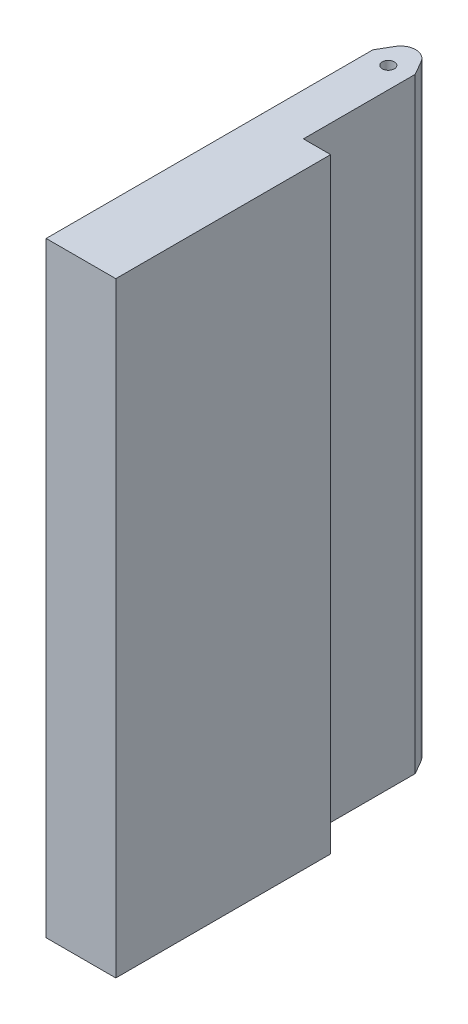
ISO-10303-21;
HEADER;
FILE_DESCRIPTION(('STEP AP214'),'2;1');
FILE_NAME('part.step','',(''),(''),'','','');
FILE_SCHEMA(('AUTOMOTIVE_DESIGN { 1 0 10303 214 1 1 1 1 }'));
ENDSEC;
DATA;
#1=APPLICATION_CONTEXT('core data for automotive mechanical design processes');
#2=APPLICATION_PROTOCOL_DEFINITION('international standard','automotive_design',2000,#1);
#3=PRODUCT_CONTEXT('',#1,'mechanical');
#4=PRODUCT('Part','Part','',(#3));
#5=PRODUCT_RELATED_PRODUCT_CATEGORY('part','',(#4));
#6=PRODUCT_DEFINITION_FORMATION('','',#4);
#7=PRODUCT_DEFINITION_CONTEXT('part definition',#1,'design');
#8=PRODUCT_DEFINITION('design','',#6,#7);
#9=PRODUCT_DEFINITION_SHAPE('','',#8);
#10=(LENGTH_UNIT() NAMED_UNIT(*) SI_UNIT(.MILLI.,.METRE.));
#11=(NAMED_UNIT(*) PLANE_ANGLE_UNIT() SI_UNIT($,.RADIAN.));
#12=(NAMED_UNIT(*) SI_UNIT($,.STERADIAN.) SOLID_ANGLE_UNIT());
#13=UNCERTAINTY_MEASURE_WITH_UNIT(LENGTH_MEASURE(1.E-05),#10,'distance_accuracy_value','');
#14=(GEOMETRIC_REPRESENTATION_CONTEXT(3) GLOBAL_UNCERTAINTY_ASSIGNED_CONTEXT((#13)) GLOBAL_UNIT_ASSIGNED_CONTEXT((#10,
#11,#12)) REPRESENTATION_CONTEXT('',''));
#15=CARTESIAN_POINT('',(0.,0.,0.));
#16=DIRECTION('',(0.,0.,1.));
#17=DIRECTION('',(1.,0.,0.));
#18=AXIS2_PLACEMENT_3D('',#15,#16,#17);
#19=CARTESIAN_POINT('',(0.,0.,-49.9999999999999));
#20=DIRECTION('',(0.,-1.,0.));
#21=DIRECTION('',(0.,0.,-1.));
#22=AXIS2_PLACEMENT_3D('',#19,#20,#21);
#23=CYLINDRICAL_SURFACE('',#22,5.);
#24=DIRECTION('',(0.,-1.,0.));
#25=VECTOR('',#24,1.);
#26=CARTESIAN_POINT('',(-4.33012701892221,0.,-52.4999999999999));
#27=LINE('',#26,#25);
#28=CARTESIAN_POINT('',(-4.33012701892221,200.,-52.4999999999999));
#29=VERTEX_POINT('',#28);
#30=CARTESIAN_POINT('',(-4.33012701892221,0.,-52.4999999999999));
#31=VERTEX_POINT('',#30);
#32=EDGE_CURVE('E157',#29,#31,#27,.T.);
#33=ORIENTED_EDGE('',*,*,#32,.F.);
#34=CARTESIAN_POINT('',(0.,200.,-49.9999999999999));
#35=DIRECTION('',(0.,1.,0.));
#36=DIRECTION('',(0.,0.,1.));
#37=AXIS2_PLACEMENT_3D('',#34,#35,#36);
#38=CIRCLE('',#37,5.);
#39=CARTESIAN_POINT('',(4.3301270189222,200.,-52.4999999999999));
#40=VERTEX_POINT('',#39);
#41=EDGE_CURVE('E41',#40,#29,#38,.T.);
#42=ORIENTED_EDGE('',*,*,#41,.F.);
#43=DIRECTION('',(0.,-1.,0.));
#44=VECTOR('',#43,1.);
#45=CARTESIAN_POINT('',(4.3301270189222,0.,-52.4999999999999));
#46=LINE('',#45,#44);
#47=CARTESIAN_POINT('',(4.3301270189222,0.,-52.4999999999999));
#48=VERTEX_POINT('',#47);
#49=EDGE_CURVE('E161',#48,#40,#46,.F.);
#50=ORIENTED_EDGE('',*,*,#49,.F.);
#51=CARTESIAN_POINT('',(0.,0.,-49.9999999999999));
#52=DIRECTION('',(0.,1.,0.));
#53=DIRECTION('',(0.,0.,1.));
#54=AXIS2_PLACEMENT_3D('',#51,#52,#53);
#55=CIRCLE('',#54,5.);
#56=EDGE_CURVE('E12',#31,#48,#55,.F.);
#57=ORIENTED_EDGE('',*,*,#56,.F.);
#58=EDGE_LOOP('',(#33,#42,#50,#57));
#59=FACE_BOUND('',#58,.T.);
#60=ADVANCED_FACE('F34',(#59),#23,.T.);
#61=CARTESIAN_POINT('',(0.,200.,0.));
#62=DIRECTION('',(0.,1.,0.));
#63=DIRECTION('',(0.,0.,1.));
#64=AXIS2_PLACEMENT_3D('',#61,#62,#63);
#65=PLANE('',#64);
#66=DIRECTION('',(1.,0.,0.));
#67=VECTOR('',#66,1.);
#68=CARTESIAN_POINT('',(7.,200.,-10.9474411167422));
#69=LINE('',#68,#67);
#70=CARTESIAN_POINT('',(7.,200.,-10.9474411167422));
#71=VERTEX_POINT('',#70);
#72=CARTESIAN_POINT('',(16.,200.,-10.9474411167422));
#73=VERTEX_POINT('',#72);
#74=EDGE_CURVE('E48',#71,#73,#69,.T.);
#75=ORIENTED_EDGE('',*,*,#74,.F.);
#76=DIRECTION('',(0.,0.,1.));
#77=VECTOR('',#76,1.);
#78=CARTESIAN_POINT('',(7.,200.,-36.9474411167422));
#79=LINE('',#78,#77);
#80=CARTESIAN_POINT('',(7.,200.,-47.8756443470177));
#81=VERTEX_POINT('',#80);
#82=EDGE_CURVE('E106',#81,#71,#79,.T.);
#83=ORIENTED_EDGE('',*,*,#82,.F.);
#84=DIRECTION('',(-0.499999999999997,0.,-0.866025403784441));
#85=VECTOR('',#84,1.);
#86=CARTESIAN_POINT('',(11.,200.,-40.9474411167422));
#87=LINE('',#86,#85);
#88=EDGE_CURVE('E144',#81,#40,#87,.T.);
#89=ORIENTED_EDGE('',*,*,#88,.T.);
#90=ORIENTED_EDGE('',*,*,#41,.T.);
#91=DIRECTION('',(-0.499999999999996,0.,0.866025403784441));
#92=VECTOR('',#91,1.);
#93=CARTESIAN_POINT('',(0.,200.,-60.));
#94=LINE('',#93,#92);
#95=CARTESIAN_POINT('',(-6.99999999999996,200.,-47.8756443470178));
#96=VERTEX_POINT('',#95);
#97=EDGE_CURVE('E147',#29,#96,#94,.T.);
#98=ORIENTED_EDGE('',*,*,#97,.T.);
#99=DIRECTION('',(0.,0.,-1.));
#100=VECTOR('',#99,1.);
#101=CARTESIAN_POINT('',(-7.00000000000001,200.,-36.9474411167422));
#102=LINE('',#101,#100);
#103=CARTESIAN_POINT('',(-7.00000000000001,200.,60.));
#104=VERTEX_POINT('',#103);
#105=EDGE_CURVE('E136',#104,#96,#102,.T.);
#106=ORIENTED_EDGE('',*,*,#105,.F.);
#107=DIRECTION('',(1.,0.,0.));
#108=VECTOR('',#107,1.);
#109=CARTESIAN_POINT('',(-11.,200.,60.));
#110=LINE('',#109,#108);
#111=CARTESIAN_POINT('',(16.,200.,60.));
#112=VERTEX_POINT('',#111);
#113=EDGE_CURVE('E154',#104,#112,#110,.T.);
#114=ORIENTED_EDGE('',*,*,#113,.T.);
#115=DIRECTION('',(0.,0.,1.));
#116=VECTOR('',#115,1.);
#117=CARTESIAN_POINT('',(16.,200.,60.));
#118=LINE('',#117,#116);
#119=EDGE_CURVE('E132',#73,#112,#118,.T.);
#120=ORIENTED_EDGE('',*,*,#119,.F.);
#121=EDGE_LOOP('',(#75,#83,#89,#90,#98,#106,#114,#120));
#122=FACE_BOUND('',#121,.T.);
#123=CARTESIAN_POINT('',(0.,200.,-45.9999999999999));
#124=DIRECTION('',(0.,1.,0.));
#125=DIRECTION('',(0.,0.,1.));
#126=AXIS2_PLACEMENT_3D('',#123,#124,#125);
#127=CIRCLE('',#126,2.);
#128=CARTESIAN_POINT('',(0.,200.,-43.9999999999999));
#129=VERTEX_POINT('',#128);
#130=EDGE_CURVE('E117',#129,#129,#127,.T.);
#131=ORIENTED_EDGE('',*,*,#130,.F.);
#132=EDGE_LOOP('',(#131));
#133=FACE_BOUND('',#132,.T.);
#134=ADVANCED_FACE('F166',(#122,#133),#65,.T.);
#135=CARTESIAN_POINT('',(0.,0.,0.));
#136=DIRECTION('',(0.,1.,0.));
#137=DIRECTION('',(0.,0.,1.));
#138=AXIS2_PLACEMENT_3D('',#135,#136,#137);
#139=PLANE('',#138);
#140=CARTESIAN_POINT('',(0.,0.,-45.9999999999999));
#141=DIRECTION('',(0.,1.,0.));
#142=DIRECTION('',(0.,0.,1.));
#143=AXIS2_PLACEMENT_3D('',#140,#141,#142);
#144=CIRCLE('',#143,2.);
#145=CARTESIAN_POINT('',(0.,0.,-43.9999999999999));
#146=VERTEX_POINT('',#145);
#147=EDGE_CURVE('E119',#146,#146,#144,.T.);
#148=ORIENTED_EDGE('',*,*,#147,.T.);
#149=EDGE_LOOP('',(#148));
#150=FACE_BOUND('',#149,.T.);
#151=DIRECTION('',(0.,0.,1.));
#152=VECTOR('',#151,1.);
#153=CARTESIAN_POINT('',(7.,0.,-36.9474411167422));
#154=LINE('',#153,#152);
#155=CARTESIAN_POINT('',(7.00000000000004,0.,-47.8756443470177));
#156=VERTEX_POINT('',#155);
#157=CARTESIAN_POINT('',(7.,0.,-10.9474411167422));
#158=VERTEX_POINT('',#157);
#159=EDGE_CURVE('E56',#156,#158,#154,.T.);
#160=ORIENTED_EDGE('',*,*,#159,.T.);
#161=DIRECTION('',(1.,0.,0.));
#162=VECTOR('',#161,1.);
#163=CARTESIAN_POINT('',(7.,0.,-10.9474411167422));
#164=LINE('',#163,#162);
#165=CARTESIAN_POINT('',(16.,0.,-10.9474411167422));
#166=VERTEX_POINT('',#165);
#167=EDGE_CURVE('E102',#158,#166,#164,.T.);
#168=ORIENTED_EDGE('',*,*,#167,.T.);
#169=DIRECTION('',(0.,0.,-1.));
#170=VECTOR('',#169,1.);
#171=CARTESIAN_POINT('',(16.,0.,60.));
#172=LINE('',#171,#170);
#173=CARTESIAN_POINT('',(16.,0.,60.));
#174=VERTEX_POINT('',#173);
#175=EDGE_CURVE('E130',#174,#166,#172,.T.);
#176=ORIENTED_EDGE('',*,*,#175,.F.);
#177=DIRECTION('',(1.,0.,0.));
#178=VECTOR('',#177,1.);
#179=CARTESIAN_POINT('',(-11.,0.,60.));
#180=LINE('',#179,#178);
#181=CARTESIAN_POINT('',(-7.00000000000001,0.,60.));
#182=VERTEX_POINT('',#181);
#183=EDGE_CURVE('E150',#182,#174,#180,.T.);
#184=ORIENTED_EDGE('',*,*,#183,.F.);
#185=DIRECTION('',(0.,0.,-1.));
#186=VECTOR('',#185,1.);
#187=CARTESIAN_POINT('',(-7.00000000000001,0.,-36.9474411167422));
#188=LINE('',#187,#186);
#189=CARTESIAN_POINT('',(-7.00000000000001,0.,-47.8756443470178));
#190=VERTEX_POINT('',#189);
#191=EDGE_CURVE('E137',#182,#190,#188,.T.);
#192=ORIENTED_EDGE('',*,*,#191,.T.);
#193=DIRECTION('',(-0.499999999999996,0.,0.866025403784441));
#194=VECTOR('',#193,1.);
#195=CARTESIAN_POINT('',(0.,0.,-60.));
#196=LINE('',#195,#194);
#197=EDGE_CURVE('E146',#31,#190,#196,.T.);
#198=ORIENTED_EDGE('',*,*,#197,.F.);
#199=ORIENTED_EDGE('',*,*,#56,.T.);
#200=DIRECTION('',(-0.499999999999997,0.,-0.866025403784441));
#201=VECTOR('',#200,1.);
#202=CARTESIAN_POINT('',(11.,0.,-40.9474411167422));
#203=LINE('',#202,#201);
#204=EDGE_CURVE('E104',#156,#48,#203,.T.);
#205=ORIENTED_EDGE('',*,*,#204,.F.);
#206=EDGE_LOOP('',(#160,#168,#176,#184,#192,#198,#199,#205));
#207=FACE_BOUND('',#206,.T.);
#208=ADVANCED_FACE('F99',(#150,#207),#139,.F.);
#209=CARTESIAN_POINT('',(-11.,200.,60.));
#210=DIRECTION('',(0.,0.,-1.));
#211=DIRECTION('',(-1.,0.,0.));
#212=AXIS2_PLACEMENT_3D('',#209,#210,#211);
#213=PLANE('',#212);
#214=ORIENTED_EDGE('',*,*,#113,.F.);
#215=DIRECTION('',(0.,1.,0.));
#216=VECTOR('',#215,1.);
#217=CARTESIAN_POINT('',(-7.00000000000001,0.,60.));
#218=LINE('',#217,#216);
#219=EDGE_CURVE('E122',#182,#104,#218,.T.);
#220=ORIENTED_EDGE('',*,*,#219,.F.);
#221=ORIENTED_EDGE('',*,*,#183,.T.);
#222=DIRECTION('',(0.,-1.,0.));
#223=VECTOR('',#222,1.);
#224=CARTESIAN_POINT('',(16.,200.,60.));
#225=LINE('',#224,#223);
#226=EDGE_CURVE('E127',#112,#174,#225,.T.);
#227=ORIENTED_EDGE('',*,*,#226,.F.);
#228=EDGE_LOOP('',(#214,#220,#221,#227));
#229=FACE_BOUND('',#228,.T.);
#230=ADVANCED_FACE('F182',(#229),#213,.F.);
#231=CARTESIAN_POINT('',(11.,0.,-40.9474411167422));
#232=DIRECTION('',(0.866025403784441,0.,-0.499999999999997));
#233=DIRECTION('',(-0.499999999999997,0.,-0.866025403784441));
#234=AXIS2_PLACEMENT_3D('',#231,#232,#233);
#235=PLANE('',#234);
#236=DIRECTION('',(0.,1.,0.));
#237=VECTOR('',#236,1.);
#238=CARTESIAN_POINT('',(7.,0.,-47.8756443470177));
#239=LINE('',#238,#237);
#240=EDGE_CURVE('E105',#156,#81,#239,.T.);
#241=ORIENTED_EDGE('',*,*,#240,.F.);
#242=ORIENTED_EDGE('',*,*,#204,.T.);
#243=ORIENTED_EDGE('',*,*,#49,.T.);
#244=ORIENTED_EDGE('',*,*,#88,.F.);
#245=EDGE_LOOP('',(#241,#242,#243,#244));
#246=FACE_BOUND('',#245,.T.);
#247=ADVANCED_FACE('F207',(#246),#235,.T.);
#248=CARTESIAN_POINT('',(0.,0.,-60.));
#249=DIRECTION('',(-0.866025403784441,0.,-0.499999999999996));
#250=DIRECTION('',(-0.499999999999996,0.,0.866025403784441));
#251=AXIS2_PLACEMENT_3D('',#248,#249,#250);
#252=PLANE('',#251);
#253=DIRECTION('',(0.,1.,0.));
#254=VECTOR('',#253,1.);
#255=CARTESIAN_POINT('',(-7.00000000000001,0.,-47.8756443470178));
#256=LINE('',#255,#254);
#257=EDGE_CURVE('E140',#190,#96,#256,.T.);
#258=ORIENTED_EDGE('',*,*,#257,.T.);
#259=ORIENTED_EDGE('',*,*,#97,.F.);
#260=ORIENTED_EDGE('',*,*,#32,.T.);
#261=ORIENTED_EDGE('',*,*,#197,.T.);
#262=EDGE_LOOP('',(#258,#259,#260,#261));
#263=FACE_BOUND('',#262,.T.);
#264=ADVANCED_FACE('F174',(#263),#252,.T.);
#265=CARTESIAN_POINT('',(-7.00000000000001,0.,-36.9474411167422));
#266=DIRECTION('',(1.,0.,0.));
#267=DIRECTION('',(0.,0.,-1.));
#268=AXIS2_PLACEMENT_3D('',#265,#266,#267);
#269=PLANE('',#268);
#270=ORIENTED_EDGE('',*,*,#105,.T.);
#271=ORIENTED_EDGE('',*,*,#257,.F.);
#272=ORIENTED_EDGE('',*,*,#191,.F.);
#273=ORIENTED_EDGE('',*,*,#219,.T.);
#274=EDGE_LOOP('',(#270,#271,#272,#273));
#275=FACE_BOUND('',#274,.T.);
#276=ADVANCED_FACE('F176',(#275),#269,.F.);
#277=CARTESIAN_POINT('',(7.,0.,-36.9474411167422));
#278=DIRECTION('',(-1.,0.,0.));
#279=DIRECTION('',(0.,0.,1.));
#280=AXIS2_PLACEMENT_3D('',#277,#278,#279);
#281=PLANE('',#280);
#282=ORIENTED_EDGE('',*,*,#82,.T.);
#283=DIRECTION('',(0.,1.,0.));
#284=VECTOR('',#283,1.);
#285=CARTESIAN_POINT('',(7.,0.,-10.9474411167422));
#286=LINE('',#285,#284);
#287=EDGE_CURVE('E108',#158,#71,#286,.T.);
#288=ORIENTED_EDGE('',*,*,#287,.F.);
#289=ORIENTED_EDGE('',*,*,#159,.F.);
#290=ORIENTED_EDGE('',*,*,#240,.T.);
#291=EDGE_LOOP('',(#282,#288,#289,#290));
#292=FACE_BOUND('',#291,.T.);
#293=ADVANCED_FACE('F109',(#292),#281,.F.);
#294=CARTESIAN_POINT('',(16.,0.,0.));
#295=DIRECTION('',(1.,0.,0.));
#296=DIRECTION('',(0.,0.,-1.));
#297=AXIS2_PLACEMENT_3D('',#294,#295,#296);
#298=PLANE('',#297);
#299=DIRECTION('',(0.,1.,0.));
#300=VECTOR('',#299,1.);
#301=CARTESIAN_POINT('',(16.,0.,-10.9474411167422));
#302=LINE('',#301,#300);
#303=EDGE_CURVE('E111',#166,#73,#302,.T.);
#304=ORIENTED_EDGE('',*,*,#303,.T.);
#305=ORIENTED_EDGE('',*,*,#119,.T.);
#306=ORIENTED_EDGE('',*,*,#226,.T.);
#307=ORIENTED_EDGE('',*,*,#175,.T.);
#308=EDGE_LOOP('',(#304,#305,#306,#307));
#309=FACE_BOUND('',#308,.T.);
#310=ADVANCED_FACE('F185',(#309),#298,.T.);
#311=CARTESIAN_POINT('',(0.,0.,-45.9999999999999));
#312=DIRECTION('',(0.,1.,0.));
#313=DIRECTION('',(0.,0.,1.));
#314=AXIS2_PLACEMENT_3D('',#311,#312,#313);
#315=CYLINDRICAL_SURFACE('',#314,2.);
#316=ORIENTED_EDGE('',*,*,#147,.F.);
#317=EDGE_LOOP('',(#316));
#318=FACE_BOUND('',#317,.T.);
#319=ORIENTED_EDGE('',*,*,#130,.T.);
#320=EDGE_LOOP('',(#319));
#321=FACE_BOUND('',#320,.T.);
#322=ADVANCED_FACE('F187',(#318,#321),#315,.F.);
#323=CARTESIAN_POINT('',(7.,0.,-10.9474411167422));
#324=DIRECTION('',(0.,0.,1.));
#325=DIRECTION('',(1.,0.,0.));
#326=AXIS2_PLACEMENT_3D('',#323,#324,#325);
#327=PLANE('',#326);
#328=ORIENTED_EDGE('',*,*,#74,.T.);
#329=ORIENTED_EDGE('',*,*,#303,.F.);
#330=ORIENTED_EDGE('',*,*,#167,.F.);
#331=ORIENTED_EDGE('',*,*,#287,.T.);
#332=EDGE_LOOP('',(#328,#329,#330,#331));
#333=FACE_BOUND('',#332,.T.);
#334=ADVANCED_FACE('F113',(#333),#327,.F.);
#335=CLOSED_SHELL('',(#60,#134,#208,#230,#247,#264,#276,#293,#310,#322,#334));
#336=MANIFOLD_SOLID_BREP('B2',#335);
#337=ADVANCED_BREP_SHAPE_REPRESENTATION('',(#18,#336),#14);
#338=SHAPE_DEFINITION_REPRESENTATION(#9,#337);
ENDSEC;
END-ISO-10303-21;
